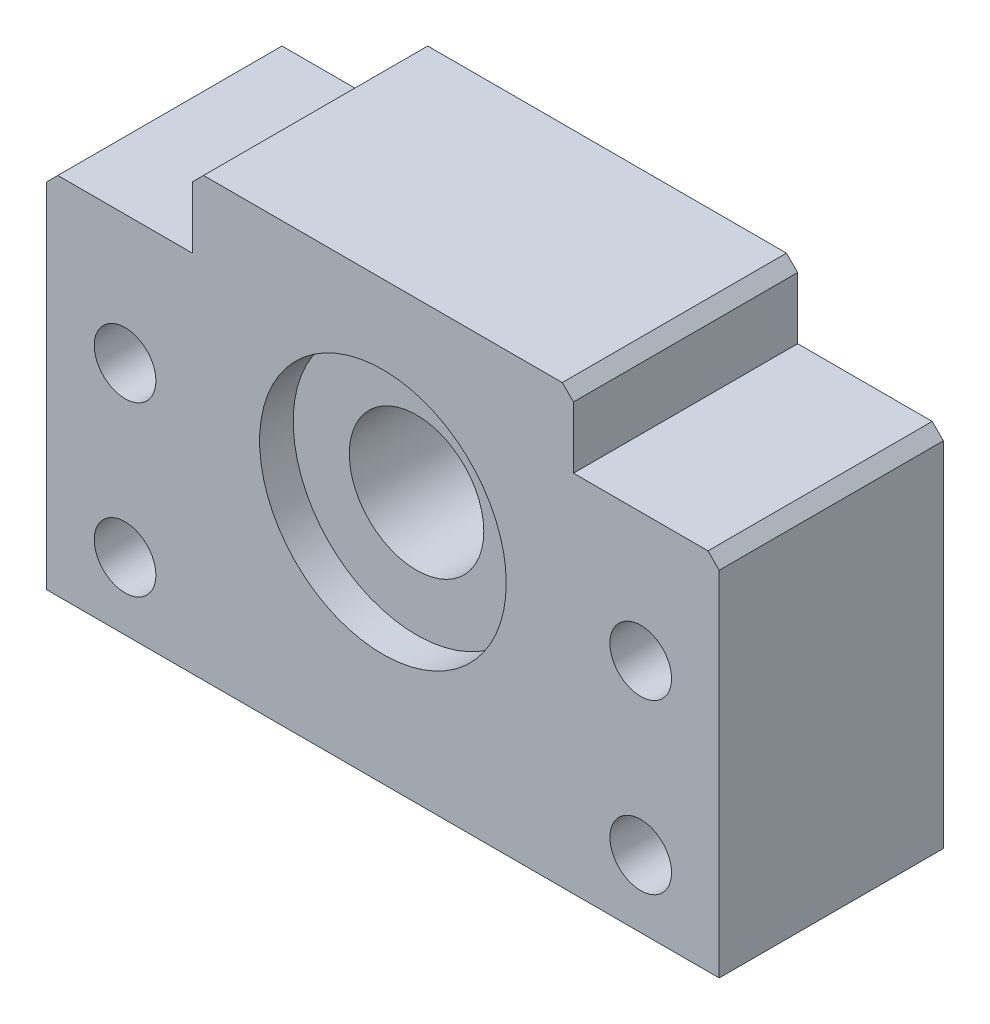
ISO-10303-21;
HEADER;
FILE_DESCRIPTION(('STEP AP214'),'2;1');
FILE_NAME('part.step','',(''),(''),'','','');
FILE_SCHEMA(('AUTOMOTIVE_DESIGN { 1 0 10303 214 1 1 1 1 }'));
ENDSEC;
DATA;
#1=APPLICATION_CONTEXT('core data for automotive mechanical design processes');
#2=APPLICATION_PROTOCOL_DEFINITION('international standard','automotive_design',2000,#1);
#3=PRODUCT_CONTEXT('',#1,'mechanical');
#4=PRODUCT('Part','Part','',(#3));
#5=PRODUCT_RELATED_PRODUCT_CATEGORY('part','',(#4));
#6=PRODUCT_DEFINITION_FORMATION('','',#4);
#7=PRODUCT_DEFINITION_CONTEXT('part definition',#1,'design');
#8=PRODUCT_DEFINITION('design','',#6,#7);
#9=PRODUCT_DEFINITION_SHAPE('','',#8);
#10=(LENGTH_UNIT() NAMED_UNIT(*) SI_UNIT(.MILLI.,.METRE.));
#11=(NAMED_UNIT(*) PLANE_ANGLE_UNIT() SI_UNIT($,.RADIAN.));
#12=(NAMED_UNIT(*) SI_UNIT($,.STERADIAN.) SOLID_ANGLE_UNIT());
#13=UNCERTAINTY_MEASURE_WITH_UNIT(LENGTH_MEASURE(1.E-05),#10,'distance_accuracy_value','');
#14=(GEOMETRIC_REPRESENTATION_CONTEXT(3) GLOBAL_UNCERTAINTY_ASSIGNED_CONTEXT((#13)) GLOBAL_UNIT_ASSIGNED_CONTEXT((#10,
#11,#12)) REPRESENTATION_CONTEXT('',''));
#15=CARTESIAN_POINT('',(0.,0.,0.));
#16=DIRECTION('',(0.,0.,1.));
#17=DIRECTION('',(1.,0.,0.));
#18=AXIS2_PLACEMENT_3D('',#15,#16,#17);
#19=CARTESIAN_POINT('',(0.,21.,0.));
#20=DIRECTION('',(0.,0.,1.));
#21=DIRECTION('',(1.,0.,0.));
#22=AXIS2_PLACEMENT_3D('',#19,#20,#21);
#23=CYLINDRICAL_SURFACE('',#22,6.);
#24=CARTESIAN_POINT('',(0.,21.,17.));
#25=DIRECTION('',(0.,0.,1.));
#26=DIRECTION('',(1.,0.,0.));
#27=AXIS2_PLACEMENT_3D('',#24,#25,#26);
#28=CIRCLE('',#27,6.);
#29=CARTESIAN_POINT('',(6.,21.,17.));
#30=VERTEX_POINT('',#29);
#31=EDGE_CURVE('E186',#30,#30,#28,.F.);
#32=ORIENTED_EDGE('',*,*,#31,.F.);
#33=EDGE_LOOP('',(#32));
#34=FACE_BOUND('',#33,.T.);
#35=CARTESIAN_POINT('',(0.,21.,3.));
#36=DIRECTION('',(0.,0.,-1.));
#37=DIRECTION('',(-1.,0.,0.));
#38=AXIS2_PLACEMENT_3D('',#35,#36,#37);
#39=CIRCLE('',#38,6.);
#40=CARTESIAN_POINT('',(-6.,21.,3.));
#41=VERTEX_POINT('',#40);
#42=EDGE_CURVE('E40',#41,#41,#39,.F.);
#43=ORIENTED_EDGE('',*,*,#42,.F.);
#44=EDGE_LOOP('',(#43));
#45=FACE_BOUND('',#44,.T.);
#46=ADVANCED_FACE('F36',(#34,#45),#23,.F.);
#47=CARTESIAN_POINT('',(0.,0.,0.));
#48=DIRECTION('',(0.,0.,1.));
#49=DIRECTION('',(1.,0.,0.));
#50=AXIS2_PLACEMENT_3D('',#47,#48,#49);
#51=PLANE('',#50);
#52=CARTESIAN_POINT('',(23.,6.00000000000001,0.));
#53=DIRECTION('',(0.,0.,-1.));
#54=DIRECTION('',(-1.,0.,0.));
#55=AXIS2_PLACEMENT_3D('',#52,#53,#54);
#56=CIRCLE('',#55,2.75);
#57=CARTESIAN_POINT('',(20.25,6.00000000000001,0.));
#58=VERTEX_POINT('',#57);
#59=EDGE_CURVE('E193',#58,#58,#56,.T.);
#60=ORIENTED_EDGE('',*,*,#59,.F.);
#61=EDGE_LOOP('',(#60));
#62=FACE_BOUND('',#61,.T.);
#63=DIRECTION('',(0.,-1.,0.));
#64=VECTOR('',#63,1.);
#65=CARTESIAN_POINT('',(-30.,32.5,0.));
#66=LINE('',#65,#64);
#67=CARTESIAN_POINT('',(-30.,31.5,0.));
#68=VERTEX_POINT('',#67);
#69=CARTESIAN_POINT('',(-30.,0.,0.));
#70=VERTEX_POINT('',#69);
#71=EDGE_CURVE('E151',#68,#70,#66,.T.);
#72=ORIENTED_EDGE('',*,*,#71,.F.);
#73=DIRECTION('',(-0.707106781186545,-0.70710678118655,0.));
#74=VECTOR('',#73,1.);
#75=CARTESIAN_POINT('',(-30.,31.5,0.));
#76=LINE('',#75,#74);
#77=CARTESIAN_POINT('',(-29.,32.5,0.));
#78=VERTEX_POINT('',#77);
#79=EDGE_CURVE('E173',#68,#78,#76,.F.);
#80=ORIENTED_EDGE('',*,*,#79,.T.);
#81=DIRECTION('',(-1.,0.,0.));
#82=VECTOR('',#81,1.);
#83=CARTESIAN_POINT('',(-17.,32.5,0.));
#84=LINE('',#83,#82);
#85=CARTESIAN_POINT('',(-17.,32.5,0.));
#86=VERTEX_POINT('',#85);
#87=EDGE_CURVE('E139',#86,#78,#84,.T.);
#88=ORIENTED_EDGE('',*,*,#87,.F.);
#89=DIRECTION('',(0.,-1.,0.));
#90=VECTOR('',#89,1.);
#91=CARTESIAN_POINT('',(-17.,39.,0.));
#92=LINE('',#91,#90);
#93=CARTESIAN_POINT('',(-17.,38.,0.));
#94=VERTEX_POINT('',#93);
#95=EDGE_CURVE('E253',#94,#86,#92,.T.);
#96=ORIENTED_EDGE('',*,*,#95,.F.);
#97=DIRECTION('',(-0.707106781186545,-0.70710678118655,0.));
#98=VECTOR('',#97,1.);
#99=CARTESIAN_POINT('',(-17.,38.,0.));
#100=LINE('',#99,#98);
#101=CARTESIAN_POINT('',(-16.,39.,0.));
#102=VERTEX_POINT('',#101);
#103=EDGE_CURVE('E169',#94,#102,#100,.F.);
#104=ORIENTED_EDGE('',*,*,#103,.T.);
#105=DIRECTION('',(-1.,0.,0.));
#106=VECTOR('',#105,1.);
#107=CARTESIAN_POINT('',(17.,39.,0.));
#108=LINE('',#107,#106);
#109=CARTESIAN_POINT('',(16.,39.,0.));
#110=VERTEX_POINT('',#109);
#111=EDGE_CURVE('E250',#110,#102,#108,.T.);
#112=ORIENTED_EDGE('',*,*,#111,.F.);
#113=DIRECTION('',(-0.707106781186548,0.707106781186548,0.));
#114=VECTOR('',#113,1.);
#115=CARTESIAN_POINT('',(16.,39.,0.));
#116=LINE('',#115,#114);
#117=CARTESIAN_POINT('',(17.,38.,0.));
#118=VERTEX_POINT('',#117);
#119=EDGE_CURVE('E156',#110,#118,#116,.F.);
#120=ORIENTED_EDGE('',*,*,#119,.T.);
#121=DIRECTION('',(0.,1.,0.));
#122=VECTOR('',#121,1.);
#123=CARTESIAN_POINT('',(17.,32.5,0.));
#124=LINE('',#123,#122);
#125=CARTESIAN_POINT('',(17.,32.5,0.));
#126=VERTEX_POINT('',#125);
#127=EDGE_CURVE('E247',#126,#118,#124,.T.);
#128=ORIENTED_EDGE('',*,*,#127,.F.);
#129=DIRECTION('',(-1.,0.,0.));
#130=VECTOR('',#129,1.);
#131=CARTESIAN_POINT('',(30.,32.5,0.));
#132=LINE('',#131,#130);
#133=CARTESIAN_POINT('',(29.,32.5,0.));
#134=VERTEX_POINT('',#133);
#135=EDGE_CURVE('E245',#134,#126,#132,.T.);
#136=ORIENTED_EDGE('',*,*,#135,.F.);
#137=DIRECTION('',(-0.707106781186548,0.707106781186548,0.));
#138=VECTOR('',#137,1.);
#139=CARTESIAN_POINT('',(29.,32.5,0.));
#140=LINE('',#139,#138);
#141=CARTESIAN_POINT('',(30.,31.5,0.));
#142=VERTEX_POINT('',#141);
#143=EDGE_CURVE('E171',#134,#142,#140,.F.);
#144=ORIENTED_EDGE('',*,*,#143,.T.);
#145=DIRECTION('',(0.,1.,0.));
#146=VECTOR('',#145,1.);
#147=CARTESIAN_POINT('',(30.,0.,0.));
#148=LINE('',#147,#146);
#149=CARTESIAN_POINT('',(30.,0.,0.));
#150=VERTEX_POINT('',#149);
#151=EDGE_CURVE('E243',#150,#142,#148,.T.);
#152=ORIENTED_EDGE('',*,*,#151,.F.);
#153=DIRECTION('',(1.,0.,0.));
#154=VECTOR('',#153,1.);
#155=CARTESIAN_POINT('',(-30.,0.,0.));
#156=LINE('',#155,#154);
#157=EDGE_CURVE('E241',#70,#150,#156,.T.);
#158=ORIENTED_EDGE('',*,*,#157,.F.);
#159=EDGE_LOOP('',(#72,#80,#88,#96,#104,#112,#120,#128,#136,#144,#152,#158));
#160=FACE_BOUND('',#159,.T.);
#161=CARTESIAN_POINT('',(-23.,21.,0.));
#162=DIRECTION('',(0.,0.,1.));
#163=DIRECTION('',(1.,0.,0.));
#164=AXIS2_PLACEMENT_3D('',#161,#162,#163);
#165=CIRCLE('',#164,2.75);
#166=CARTESIAN_POINT('',(-20.25,21.,0.));
#167=VERTEX_POINT('',#166);
#168=EDGE_CURVE('E221',#167,#167,#165,.T.);
#169=ORIENTED_EDGE('',*,*,#168,.T.);
#170=EDGE_LOOP('',(#169));
#171=FACE_BOUND('',#170,.T.);
#172=CARTESIAN_POINT('',(-23.,6.00000000000001,0.));
#173=DIRECTION('',(0.,0.,1.));
#174=DIRECTION('',(1.,0.,0.));
#175=AXIS2_PLACEMENT_3D('',#172,#173,#174);
#176=CIRCLE('',#175,2.75);
#177=CARTESIAN_POINT('',(-20.25,6.00000000000001,0.));
#178=VERTEX_POINT('',#177);
#179=EDGE_CURVE('E215',#178,#178,#176,.T.);
#180=ORIENTED_EDGE('',*,*,#179,.T.);
#181=EDGE_LOOP('',(#180));
#182=FACE_BOUND('',#181,.T.);
#183=CARTESIAN_POINT('',(23.,21.,0.));
#184=DIRECTION('',(0.,0.,-1.));
#185=DIRECTION('',(-1.,0.,0.));
#186=AXIS2_PLACEMENT_3D('',#183,#184,#185);
#187=CIRCLE('',#186,2.75);
#188=CARTESIAN_POINT('',(20.25,21.,0.));
#189=VERTEX_POINT('',#188);
#190=EDGE_CURVE('E209',#189,#189,#187,.T.);
#191=ORIENTED_EDGE('',*,*,#190,.F.);
#192=EDGE_LOOP('',(#191));
#193=FACE_BOUND('',#192,.T.);
#194=CARTESIAN_POINT('',(0.,21.,0.));
#195=DIRECTION('',(0.,0.,1.));
#196=DIRECTION('',(1.,0.,0.));
#197=AXIS2_PLACEMENT_3D('',#194,#195,#196);
#198=CIRCLE('',#197,11.);
#199=CARTESIAN_POINT('',(11.,21.,0.));
#200=VERTEX_POINT('',#199);
#201=EDGE_CURVE('E203',#200,#200,#198,.T.);
#202=ORIENTED_EDGE('',*,*,#201,.T.);
#203=EDGE_LOOP('',(#202));
#204=FACE_BOUND('',#203,.T.);
#205=ADVANCED_FACE('F268',(#62,#160,#171,#182,#193,#204),#51,.F.);
#206=CARTESIAN_POINT('',(0.,0.,20.));
#207=DIRECTION('',(0.,0.,1.));
#208=DIRECTION('',(1.,0.,0.));
#209=AXIS2_PLACEMENT_3D('',#206,#207,#208);
#210=PLANE('',#209);
#211=CARTESIAN_POINT('',(0.,21.,20.));
#212=DIRECTION('',(0.,0.,1.));
#213=DIRECTION('',(1.,0.,0.));
#214=AXIS2_PLACEMENT_3D('',#211,#212,#213);
#215=CIRCLE('',#214,11.);
#216=CARTESIAN_POINT('',(11.,21.,20.));
#217=VERTEX_POINT('',#216);
#218=EDGE_CURVE('E196',#217,#217,#215,.T.);
#219=ORIENTED_EDGE('',*,*,#218,.F.);
#220=EDGE_LOOP('',(#219));
#221=FACE_BOUND('',#220,.T.);
#222=CARTESIAN_POINT('',(23.,21.,20.));
#223=DIRECTION('',(0.,0.,-1.));
#224=DIRECTION('',(-1.,0.,0.));
#225=AXIS2_PLACEMENT_3D('',#222,#223,#224);
#226=CIRCLE('',#225,2.75);
#227=CARTESIAN_POINT('',(20.25,21.,20.));
#228=VERTEX_POINT('',#227);
#229=EDGE_CURVE('E207',#228,#228,#226,.T.);
#230=ORIENTED_EDGE('',*,*,#229,.T.);
#231=EDGE_LOOP('',(#230));
#232=FACE_BOUND('',#231,.T.);
#233=CARTESIAN_POINT('',(-23.,6.00000000000001,20.));
#234=DIRECTION('',(0.,0.,1.));
#235=DIRECTION('',(1.,0.,0.));
#236=AXIS2_PLACEMENT_3D('',#233,#234,#235);
#237=CIRCLE('',#236,2.75);
#238=CARTESIAN_POINT('',(-20.25,6.00000000000001,20.));
#239=VERTEX_POINT('',#238);
#240=EDGE_CURVE('E212',#239,#239,#237,.T.);
#241=ORIENTED_EDGE('',*,*,#240,.F.);
#242=EDGE_LOOP('',(#241));
#243=FACE_BOUND('',#242,.T.);
#244=CARTESIAN_POINT('',(-23.,21.,20.));
#245=DIRECTION('',(0.,0.,1.));
#246=DIRECTION('',(1.,0.,0.));
#247=AXIS2_PLACEMENT_3D('',#244,#245,#246);
#248=CIRCLE('',#247,2.75);
#249=CARTESIAN_POINT('',(-20.25,21.,20.));
#250=VERTEX_POINT('',#249);
#251=EDGE_CURVE('E218',#250,#250,#248,.T.);
#252=ORIENTED_EDGE('',*,*,#251,.F.);
#253=EDGE_LOOP('',(#252));
#254=FACE_BOUND('',#253,.T.);
#255=DIRECTION('',(-1.,0.,0.));
#256=VECTOR('',#255,1.);
#257=CARTESIAN_POINT('',(-17.,32.5,20.));
#258=LINE('',#257,#256);
#259=CARTESIAN_POINT('',(-17.,32.5,20.));
#260=VERTEX_POINT('',#259);
#261=CARTESIAN_POINT('',(-29.,32.5,20.));
#262=VERTEX_POINT('',#261);
#263=EDGE_CURVE('E237',#260,#262,#258,.T.);
#264=ORIENTED_EDGE('',*,*,#263,.T.);
#265=DIRECTION('',(0.707106781186545,0.70710678118655,0.));
#266=VECTOR('',#265,1.);
#267=CARTESIAN_POINT('',(-30.7500000000001,30.7499999999999,20.));
#268=LINE('',#267,#266);
#269=CARTESIAN_POINT('',(-30.,31.5,20.));
#270=VERTEX_POINT('',#269);
#271=EDGE_CURVE('E134',#262,#270,#268,.F.);
#272=ORIENTED_EDGE('',*,*,#271,.T.);
#273=DIRECTION('',(0.,-1.,0.));
#274=VECTOR('',#273,1.);
#275=CARTESIAN_POINT('',(-30.,32.5,20.));
#276=LINE('',#275,#274);
#277=CARTESIAN_POINT('',(-30.,0.,20.));
#278=VERTEX_POINT('',#277);
#279=EDGE_CURVE('E126',#270,#278,#276,.T.);
#280=ORIENTED_EDGE('',*,*,#279,.T.);
#281=DIRECTION('',(1.,0.,0.));
#282=VECTOR('',#281,1.);
#283=CARTESIAN_POINT('',(-30.,0.,20.));
#284=LINE('',#283,#282);
#285=CARTESIAN_POINT('',(30.,0.,20.));
#286=VERTEX_POINT('',#285);
#287=EDGE_CURVE('E131',#278,#286,#284,.T.);
#288=ORIENTED_EDGE('',*,*,#287,.T.);
#289=DIRECTION('',(0.,1.,0.));
#290=VECTOR('',#289,1.);
#291=CARTESIAN_POINT('',(30.,0.,20.));
#292=LINE('',#291,#290);
#293=CARTESIAN_POINT('',(30.,31.5,20.));
#294=VERTEX_POINT('',#293);
#295=EDGE_CURVE('E147',#286,#294,#292,.T.);
#296=ORIENTED_EDGE('',*,*,#295,.T.);
#297=DIRECTION('',(0.707106781186548,-0.707106781186548,0.));
#298=VECTOR('',#297,1.);
#299=CARTESIAN_POINT('',(30.75,30.75,20.));
#300=LINE('',#299,#298);
#301=CARTESIAN_POINT('',(29.,32.5,20.));
#302=VERTEX_POINT('',#301);
#303=EDGE_CURVE('E53',#294,#302,#300,.F.);
#304=ORIENTED_EDGE('',*,*,#303,.T.);
#305=DIRECTION('',(-1.,0.,0.));
#306=VECTOR('',#305,1.);
#307=CARTESIAN_POINT('',(30.,32.5,20.));
#308=LINE('',#307,#306);
#309=CARTESIAN_POINT('',(17.,32.5,20.));
#310=VERTEX_POINT('',#309);
#311=EDGE_CURVE('E227',#302,#310,#308,.T.);
#312=ORIENTED_EDGE('',*,*,#311,.T.);
#313=DIRECTION('',(0.,1.,0.));
#314=VECTOR('',#313,1.);
#315=CARTESIAN_POINT('',(17.,32.5,20.));
#316=LINE('',#315,#314);
#317=CARTESIAN_POINT('',(17.,38.,20.));
#318=VERTEX_POINT('',#317);
#319=EDGE_CURVE('E229',#310,#318,#316,.T.);
#320=ORIENTED_EDGE('',*,*,#319,.T.);
#321=DIRECTION('',(0.707106781186548,-0.707106781186548,0.));
#322=VECTOR('',#321,1.);
#323=CARTESIAN_POINT('',(27.5,27.5,20.));
#324=LINE('',#323,#322);
#325=CARTESIAN_POINT('',(16.,39.,20.));
#326=VERTEX_POINT('',#325);
#327=EDGE_CURVE('E165',#318,#326,#324,.F.);
#328=ORIENTED_EDGE('',*,*,#327,.T.);
#329=DIRECTION('',(-1.,0.,0.));
#330=VECTOR('',#329,1.);
#331=CARTESIAN_POINT('',(17.,39.,20.));
#332=LINE('',#331,#330);
#333=CARTESIAN_POINT('',(-16.,39.,20.));
#334=VERTEX_POINT('',#333);
#335=EDGE_CURVE('E232',#326,#334,#332,.T.);
#336=ORIENTED_EDGE('',*,*,#335,.T.);
#337=DIRECTION('',(0.707106781186545,0.70710678118655,0.));
#338=VECTOR('',#337,1.);
#339=CARTESIAN_POINT('',(-27.5,27.4999999999999,20.));
#340=LINE('',#339,#338);
#341=CARTESIAN_POINT('',(-17.,38.,20.));
#342=VERTEX_POINT('',#341);
#343=EDGE_CURVE('E177',#334,#342,#340,.F.);
#344=ORIENTED_EDGE('',*,*,#343,.T.);
#345=DIRECTION('',(0.,-1.,0.));
#346=VECTOR('',#345,1.);
#347=CARTESIAN_POINT('',(-17.,39.,20.));
#348=LINE('',#347,#346);
#349=EDGE_CURVE('E235',#342,#260,#348,.T.);
#350=ORIENTED_EDGE('',*,*,#349,.T.);
#351=EDGE_LOOP('',(#264,#272,#280,#288,#296,#304,#312,#320,#328,#336,#344,#350));
#352=FACE_BOUND('',#351,.T.);
#353=CARTESIAN_POINT('',(23.,6.00000000000001,20.));
#354=DIRECTION('',(0.,0.,-1.));
#355=DIRECTION('',(-1.,0.,0.));
#356=AXIS2_PLACEMENT_3D('',#353,#354,#355);
#357=CIRCLE('',#356,2.75);
#358=CARTESIAN_POINT('',(20.25,6.00000000000001,20.));
#359=VERTEX_POINT('',#358);
#360=EDGE_CURVE('E188',#359,#359,#357,.T.);
#361=ORIENTED_EDGE('',*,*,#360,.T.);
#362=EDGE_LOOP('',(#361));
#363=FACE_BOUND('',#362,.T.);
#364=ADVANCED_FACE('F129',(#221,#232,#243,#254,#352,#363),#210,.T.);
#365=CARTESIAN_POINT('',(-30.,32.5,20.));
#366=DIRECTION('',(1.,0.,0.));
#367=DIRECTION('',(0.,0.,-1.));
#368=AXIS2_PLACEMENT_3D('',#365,#366,#367);
#369=PLANE('',#368);
#370=ORIENTED_EDGE('',*,*,#279,.F.);
#371=DIRECTION('',(0.,0.,-1.));
#372=VECTOR('',#371,1.);
#373=CARTESIAN_POINT('',(-30.,31.5,20.));
#374=LINE('',#373,#372);
#375=EDGE_CURVE('E167',#270,#68,#374,.T.);
#376=ORIENTED_EDGE('',*,*,#375,.T.);
#377=ORIENTED_EDGE('',*,*,#71,.T.);
#378=DIRECTION('',(0.,0.,-1.));
#379=VECTOR('',#378,1.);
#380=CARTESIAN_POINT('',(-30.,0.,20.));
#381=LINE('',#380,#379);
#382=EDGE_CURVE('E144',#278,#70,#381,.T.);
#383=ORIENTED_EDGE('',*,*,#382,.F.);
#384=EDGE_LOOP('',(#370,#376,#377,#383));
#385=FACE_BOUND('',#384,.T.);
#386=ADVANCED_FACE('F149',(#385),#369,.F.);
#387=CARTESIAN_POINT('',(-30.,0.,20.));
#388=DIRECTION('',(0.,1.,0.));
#389=DIRECTION('',(0.,0.,1.));
#390=AXIS2_PLACEMENT_3D('',#387,#388,#389);
#391=PLANE('',#390);
#392=ORIENTED_EDGE('',*,*,#157,.T.);
#393=DIRECTION('',(0.,0.,-1.));
#394=VECTOR('',#393,1.);
#395=CARTESIAN_POINT('',(30.,0.,20.));
#396=LINE('',#395,#394);
#397=EDGE_CURVE('E146',#286,#150,#396,.T.);
#398=ORIENTED_EDGE('',*,*,#397,.F.);
#399=ORIENTED_EDGE('',*,*,#287,.F.);
#400=ORIENTED_EDGE('',*,*,#382,.T.);
#401=EDGE_LOOP('',(#392,#398,#399,#400));
#402=FACE_BOUND('',#401,.T.);
#403=ADVANCED_FACE('F143',(#402),#391,.F.);
#404=CARTESIAN_POINT('',(30.,0.,20.));
#405=DIRECTION('',(-1.,0.,0.));
#406=DIRECTION('',(0.,0.,1.));
#407=AXIS2_PLACEMENT_3D('',#404,#405,#406);
#408=PLANE('',#407);
#409=ORIENTED_EDGE('',*,*,#151,.T.);
#410=DIRECTION('',(0.,0.,1.));
#411=VECTOR('',#410,1.);
#412=CARTESIAN_POINT('',(30.,31.5,20.));
#413=LINE('',#412,#411);
#414=EDGE_CURVE('E61',#142,#294,#413,.T.);
#415=ORIENTED_EDGE('',*,*,#414,.T.);
#416=ORIENTED_EDGE('',*,*,#295,.F.);
#417=ORIENTED_EDGE('',*,*,#397,.T.);
#418=EDGE_LOOP('',(#409,#415,#416,#417));
#419=FACE_BOUND('',#418,.T.);
#420=ADVANCED_FACE('F295',(#419),#408,.F.);
#421=CARTESIAN_POINT('',(30.,32.5,20.));
#422=DIRECTION('',(0.,-1.,0.));
#423=DIRECTION('',(0.,0.,-1.));
#424=AXIS2_PLACEMENT_3D('',#421,#422,#423);
#425=PLANE('',#424);
#426=ORIENTED_EDGE('',*,*,#311,.F.);
#427=DIRECTION('',(0.,0.,-1.));
#428=VECTOR('',#427,1.);
#429=CARTESIAN_POINT('',(29.,32.5,20.));
#430=LINE('',#429,#428);
#431=EDGE_CURVE('E181',#302,#134,#430,.T.);
#432=ORIENTED_EDGE('',*,*,#431,.T.);
#433=ORIENTED_EDGE('',*,*,#135,.T.);
#434=DIRECTION('',(0.,0.,-1.));
#435=VECTOR('',#434,1.);
#436=CARTESIAN_POINT('',(17.,32.5,20.));
#437=LINE('',#436,#435);
#438=EDGE_CURVE('E158',#310,#126,#437,.T.);
#439=ORIENTED_EDGE('',*,*,#438,.F.);
#440=EDGE_LOOP('',(#426,#432,#433,#439));
#441=FACE_BOUND('',#440,.T.);
#442=ADVANCED_FACE('F299',(#441),#425,.F.);
#443=CARTESIAN_POINT('',(17.,32.5,20.));
#444=DIRECTION('',(-1.,0.,0.));
#445=DIRECTION('',(0.,0.,1.));
#446=AXIS2_PLACEMENT_3D('',#443,#444,#445);
#447=PLANE('',#446);
#448=ORIENTED_EDGE('',*,*,#127,.T.);
#449=DIRECTION('',(0.,0.,1.));
#450=VECTOR('',#449,1.);
#451=CARTESIAN_POINT('',(17.,38.,20.));
#452=LINE('',#451,#450);
#453=EDGE_CURVE('E163',#118,#318,#452,.T.);
#454=ORIENTED_EDGE('',*,*,#453,.T.);
#455=ORIENTED_EDGE('',*,*,#319,.F.);
#456=ORIENTED_EDGE('',*,*,#438,.T.);
#457=EDGE_LOOP('',(#448,#454,#455,#456));
#458=FACE_BOUND('',#457,.T.);
#459=ADVANCED_FACE('F263',(#458),#447,.F.);
#460=CARTESIAN_POINT('',(17.,39.,20.));
#461=DIRECTION('',(0.,-1.,0.));
#462=DIRECTION('',(1.,0.,0.));
#463=AXIS2_PLACEMENT_3D('',#460,#461,#462);
#464=PLANE('',#463);
#465=ORIENTED_EDGE('',*,*,#111,.T.);
#466=DIRECTION('',(0.,0.,1.));
#467=VECTOR('',#466,1.);
#468=CARTESIAN_POINT('',(-16.,39.,20.));
#469=LINE('',#468,#467);
#470=EDGE_CURVE('E11',#102,#334,#469,.T.);
#471=ORIENTED_EDGE('',*,*,#470,.T.);
#472=ORIENTED_EDGE('',*,*,#335,.F.);
#473=DIRECTION('',(0.,0.,-1.));
#474=VECTOR('',#473,1.);
#475=CARTESIAN_POINT('',(16.,39.,20.));
#476=LINE('',#475,#474);
#477=EDGE_CURVE('E153',#326,#110,#476,.T.);
#478=ORIENTED_EDGE('',*,*,#477,.T.);
#479=EDGE_LOOP('',(#465,#471,#472,#478));
#480=FACE_BOUND('',#479,.T.);
#481=ADVANCED_FACE('F277',(#480),#464,.F.);
#482=CARTESIAN_POINT('',(-17.,39.,20.));
#483=DIRECTION('',(1.,0.,0.));
#484=DIRECTION('',(0.,0.,-1.));
#485=AXIS2_PLACEMENT_3D('',#482,#483,#484);
#486=PLANE('',#485);
#487=ORIENTED_EDGE('',*,*,#349,.F.);
#488=DIRECTION('',(0.,0.,-1.));
#489=VECTOR('',#488,1.);
#490=CARTESIAN_POINT('',(-17.,38.,20.));
#491=LINE('',#490,#489);
#492=EDGE_CURVE('E45',#342,#94,#491,.T.);
#493=ORIENTED_EDGE('',*,*,#492,.T.);
#494=ORIENTED_EDGE('',*,*,#95,.T.);
#495=DIRECTION('',(0.,0.,-1.));
#496=VECTOR('',#495,1.);
#497=CARTESIAN_POINT('',(-17.,32.5,20.));
#498=LINE('',#497,#496);
#499=EDGE_CURVE('E239',#260,#86,#498,.T.);
#500=ORIENTED_EDGE('',*,*,#499,.F.);
#501=EDGE_LOOP('',(#487,#493,#494,#500));
#502=FACE_BOUND('',#501,.T.);
#503=ADVANCED_FACE('F285',(#502),#486,.F.);
#504=CARTESIAN_POINT('',(-17.,32.5,20.));
#505=DIRECTION('',(0.,-1.,0.));
#506=DIRECTION('',(1.,0.,0.));
#507=AXIS2_PLACEMENT_3D('',#504,#505,#506);
#508=PLANE('',#507);
#509=ORIENTED_EDGE('',*,*,#87,.T.);
#510=DIRECTION('',(0.,0.,1.));
#511=VECTOR('',#510,1.);
#512=CARTESIAN_POINT('',(-29.,32.5,20.));
#513=LINE('',#512,#511);
#514=EDGE_CURVE('E175',#78,#262,#513,.T.);
#515=ORIENTED_EDGE('',*,*,#514,.T.);
#516=ORIENTED_EDGE('',*,*,#263,.F.);
#517=ORIENTED_EDGE('',*,*,#499,.T.);
#518=EDGE_LOOP('',(#509,#515,#516,#517));
#519=FACE_BOUND('',#518,.T.);
#520=ADVANCED_FACE('F290',(#519),#508,.F.);
#521=CARTESIAN_POINT('',(16.,39.,20.));
#522=DIRECTION('',(-0.707106781186547,-0.707106781186547,0.));
#523=DIRECTION('',(0.,0.,-1.));
#524=AXIS2_PLACEMENT_3D('',#521,#522,#523);
#525=PLANE('',#524);
#526=ORIENTED_EDGE('',*,*,#327,.F.);
#527=ORIENTED_EDGE('',*,*,#453,.F.);
#528=ORIENTED_EDGE('',*,*,#119,.F.);
#529=ORIENTED_EDGE('',*,*,#477,.F.);
#530=EDGE_LOOP('',(#526,#527,#528,#529));
#531=FACE_BOUND('',#530,.T.);
#532=ADVANCED_FACE('F274',(#531),#525,.F.);
#533=CARTESIAN_POINT('',(-30.,31.5,20.));
#534=DIRECTION('',(0.70710678118655,-0.707106781186545,0.));
#535=DIRECTION('',(0.,0.,-1.));
#536=AXIS2_PLACEMENT_3D('',#533,#534,#535);
#537=PLANE('',#536);
#538=ORIENTED_EDGE('',*,*,#271,.F.);
#539=ORIENTED_EDGE('',*,*,#514,.F.);
#540=ORIENTED_EDGE('',*,*,#79,.F.);
#541=ORIENTED_EDGE('',*,*,#375,.F.);
#542=EDGE_LOOP('',(#538,#539,#540,#541));
#543=FACE_BOUND('',#542,.T.);
#544=ADVANCED_FACE('F293',(#543),#537,.F.);
#545=CARTESIAN_POINT('',(29.,32.5,20.));
#546=DIRECTION('',(-0.707106781186547,-0.707106781186547,0.));
#547=DIRECTION('',(0.,0.,-1.));
#548=AXIS2_PLACEMENT_3D('',#545,#546,#547);
#549=PLANE('',#548);
#550=ORIENTED_EDGE('',*,*,#303,.F.);
#551=ORIENTED_EDGE('',*,*,#414,.F.);
#552=ORIENTED_EDGE('',*,*,#143,.F.);
#553=ORIENTED_EDGE('',*,*,#431,.F.);
#554=EDGE_LOOP('',(#550,#551,#552,#553));
#555=FACE_BOUND('',#554,.T.);
#556=ADVANCED_FACE('F298',(#555),#549,.F.);
#557=CARTESIAN_POINT('',(-17.,38.,20.));
#558=DIRECTION('',(0.70710678118655,-0.707106781186545,0.));
#559=DIRECTION('',(0.,0.,-1.));
#560=AXIS2_PLACEMENT_3D('',#557,#558,#559);
#561=PLANE('',#560);
#562=ORIENTED_EDGE('',*,*,#343,.F.);
#563=ORIENTED_EDGE('',*,*,#470,.F.);
#564=ORIENTED_EDGE('',*,*,#103,.F.);
#565=ORIENTED_EDGE('',*,*,#492,.F.);
#566=EDGE_LOOP('',(#562,#563,#564,#565));
#567=FACE_BOUND('',#566,.T.);
#568=ADVANCED_FACE('F38',(#567),#561,.F.);
#569=CARTESIAN_POINT('',(-23.,21.,0.));
#570=DIRECTION('',(0.,0.,1.));
#571=DIRECTION('',(1.,0.,0.));
#572=AXIS2_PLACEMENT_3D('',#569,#570,#571);
#573=CYLINDRICAL_SURFACE('',#572,2.75);
#574=ORIENTED_EDGE('',*,*,#168,.F.);
#575=EDGE_LOOP('',(#574));
#576=FACE_BOUND('',#575,.T.);
#577=ORIENTED_EDGE('',*,*,#251,.T.);
#578=EDGE_LOOP('',(#577));
#579=FACE_BOUND('',#578,.T.);
#580=ADVANCED_FACE('F333',(#576,#579),#573,.F.);
#581=CARTESIAN_POINT('',(-23.,6.00000000000001,0.));
#582=DIRECTION('',(0.,0.,1.));
#583=DIRECTION('',(1.,0.,0.));
#584=AXIS2_PLACEMENT_3D('',#581,#582,#583);
#585=CYLINDRICAL_SURFACE('',#584,2.75);
#586=ORIENTED_EDGE('',*,*,#179,.F.);
#587=EDGE_LOOP('',(#586));
#588=FACE_BOUND('',#587,.T.);
#589=ORIENTED_EDGE('',*,*,#240,.T.);
#590=EDGE_LOOP('',(#589));
#591=FACE_BOUND('',#590,.T.);
#592=ADVANCED_FACE('F329',(#588,#591),#585,.F.);
#593=CARTESIAN_POINT('',(23.,21.,0.));
#594=DIRECTION('',(0.,0.,1.));
#595=DIRECTION('',(1.,0.,0.));
#596=AXIS2_PLACEMENT_3D('',#593,#594,#595);
#597=CYLINDRICAL_SURFACE('',#596,2.75);
#598=ORIENTED_EDGE('',*,*,#190,.T.);
#599=EDGE_LOOP('',(#598));
#600=FACE_BOUND('',#599,.T.);
#601=ORIENTED_EDGE('',*,*,#229,.F.);
#602=EDGE_LOOP('',(#601));
#603=FACE_BOUND('',#602,.T.);
#604=ADVANCED_FACE('F325',(#600,#603),#597,.F.);
#605=CARTESIAN_POINT('',(23.,6.00000000000001,0.));
#606=DIRECTION('',(0.,0.,1.));
#607=DIRECTION('',(1.,0.,0.));
#608=AXIS2_PLACEMENT_3D('',#605,#606,#607);
#609=CYLINDRICAL_SURFACE('',#608,2.75);
#610=ORIENTED_EDGE('',*,*,#59,.T.);
#611=EDGE_LOOP('',(#610));
#612=FACE_BOUND('',#611,.T.);
#613=ORIENTED_EDGE('',*,*,#360,.F.);
#614=EDGE_LOOP('',(#613));
#615=FACE_BOUND('',#614,.T.);
#616=ADVANCED_FACE('F321',(#612,#615),#609,.F.);
#617=CARTESIAN_POINT('',(0.,21.,17.));
#618=DIRECTION('',(0.,0.,1.));
#619=DIRECTION('',(1.,0.,0.));
#620=AXIS2_PLACEMENT_3D('',#617,#618,#619);
#621=PLANE('',#620);
#622=CARTESIAN_POINT('',(0.,21.,17.));
#623=DIRECTION('',(0.,0.,1.));
#624=DIRECTION('',(1.,0.,0.));
#625=AXIS2_PLACEMENT_3D('',#622,#623,#624);
#626=CIRCLE('',#625,11.);
#627=CARTESIAN_POINT('',(11.,21.,17.));
#628=VERTEX_POINT('',#627);
#629=EDGE_CURVE('E189',#628,#628,#626,.T.);
#630=ORIENTED_EDGE('',*,*,#629,.T.);
#631=EDGE_LOOP('',(#630));
#632=FACE_BOUND('',#631,.T.);
#633=ORIENTED_EDGE('',*,*,#31,.T.);
#634=EDGE_LOOP('',(#633));
#635=FACE_BOUND('',#634,.T.);
#636=ADVANCED_FACE('F324',(#632,#635),#621,.T.);
#637=CARTESIAN_POINT('',(0.,21.,17.));
#638=DIRECTION('',(0.,0.,1.));
#639=DIRECTION('',(1.,0.,0.));
#640=AXIS2_PLACEMENT_3D('',#637,#638,#639);
#641=CYLINDRICAL_SURFACE('',#640,11.);
#642=ORIENTED_EDGE('',*,*,#629,.F.);
#643=EDGE_LOOP('',(#642));
#644=FACE_BOUND('',#643,.T.);
#645=ORIENTED_EDGE('',*,*,#218,.T.);
#646=EDGE_LOOP('',(#645));
#647=FACE_BOUND('',#646,.T.);
#648=ADVANCED_FACE('F319',(#644,#647),#641,.F.);
#649=CARTESIAN_POINT('',(0.,21.,3.));
#650=DIRECTION('',(0.,0.,-1.));
#651=DIRECTION('',(1.,0.,0.));
#652=AXIS2_PLACEMENT_3D('',#649,#650,#651);
#653=PLANE('',#652);
#654=CARTESIAN_POINT('',(0.,21.,3.));
#655=DIRECTION('',(0.,0.,1.));
#656=DIRECTION('',(1.,0.,0.));
#657=AXIS2_PLACEMENT_3D('',#654,#655,#656);
#658=CIRCLE('',#657,11.);
#659=CARTESIAN_POINT('',(11.,21.,3.));
#660=VERTEX_POINT('',#659);
#661=EDGE_CURVE('E504',#660,#660,#658,.T.);
#662=ORIENTED_EDGE('',*,*,#661,.F.);
#663=EDGE_LOOP('',(#662));
#664=FACE_BOUND('',#663,.T.);
#665=ORIENTED_EDGE('',*,*,#42,.T.);
#666=EDGE_LOOP('',(#665));
#667=FACE_BOUND('',#666,.T.);
#668=ADVANCED_FACE('F409',(#664,#667),#653,.T.);
#669=CARTESIAN_POINT('',(0.,21.,3.));
#670=DIRECTION('',(0.,0.,-1.));
#671=DIRECTION('',(-1.,0.,0.));
#672=AXIS2_PLACEMENT_3D('',#669,#670,#671);
#673=CYLINDRICAL_SURFACE('',#672,11.);
#674=ORIENTED_EDGE('',*,*,#661,.T.);
#675=EDGE_LOOP('',(#674));
#676=FACE_BOUND('',#675,.T.);
#677=ORIENTED_EDGE('',*,*,#201,.F.);
#678=EDGE_LOOP('',(#677));
#679=FACE_BOUND('',#678,.T.);
#680=ADVANCED_FACE('F416',(#676,#679),#673,.F.);
#681=CLOSED_SHELL('',(#46,#205,#364,#386,#403,#420,#442,#459,#481,#503,#520,#532,#544,#556,#568,
#580,#592,#604,#616,#636,#648,#668,#680));
#682=MANIFOLD_SOLID_BREP('B2',#681);
#683=ADVANCED_BREP_SHAPE_REPRESENTATION('',(#18,#682),#14);
#684=SHAPE_DEFINITION_REPRESENTATION(#9,#683);
ENDSEC;
END-ISO-10303-21;
